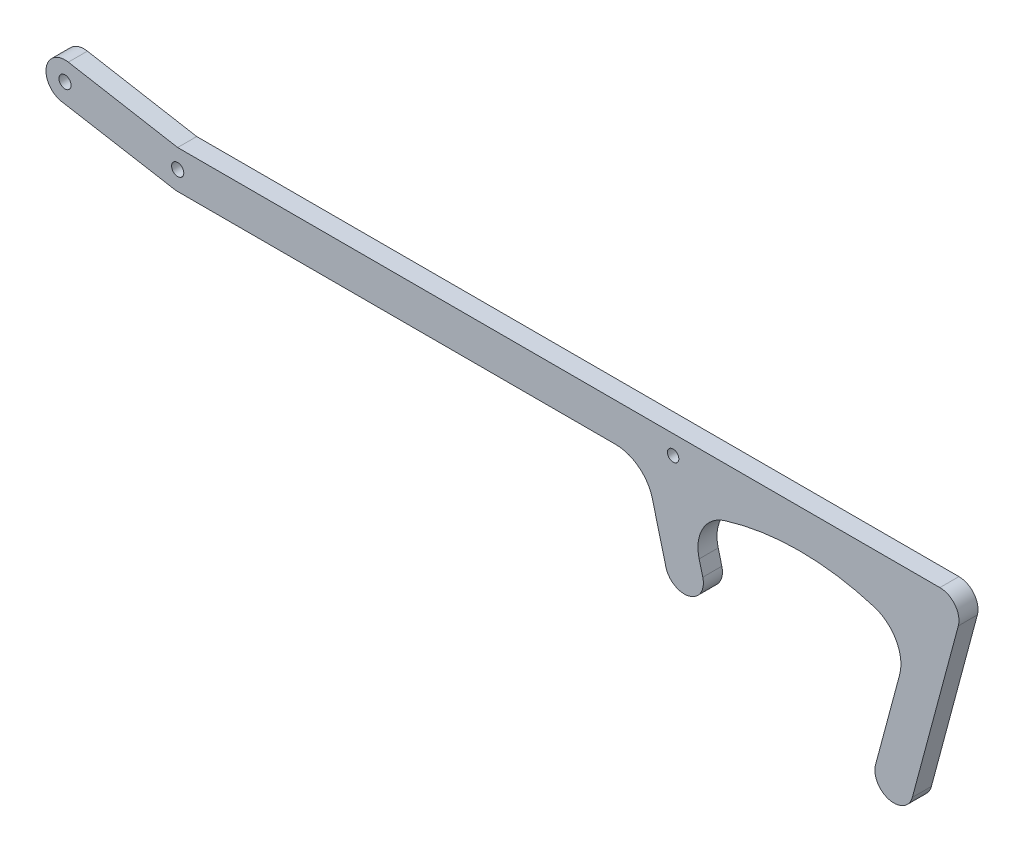
ISO-10303-21;
HEADER;
FILE_DESCRIPTION(('STEP AP214'),'2;1');
FILE_NAME('part.step','',(''),(''),'','','');
FILE_SCHEMA(('AUTOMOTIVE_DESIGN { 1 0 10303 214 1 1 1 1 }'));
ENDSEC;
DATA;
#1=APPLICATION_CONTEXT('core data for automotive mechanical design processes');
#2=APPLICATION_PROTOCOL_DEFINITION('international standard','automotive_design',2000,#1);
#3=PRODUCT_CONTEXT('',#1,'mechanical');
#4=PRODUCT('Part','Part','',(#3));
#5=PRODUCT_RELATED_PRODUCT_CATEGORY('part','',(#4));
#6=PRODUCT_DEFINITION_FORMATION('','',#4);
#7=PRODUCT_DEFINITION_CONTEXT('part definition',#1,'design');
#8=PRODUCT_DEFINITION('design','',#6,#7);
#9=PRODUCT_DEFINITION_SHAPE('','',#8);
#10=(LENGTH_UNIT() NAMED_UNIT(*) SI_UNIT(.MILLI.,.METRE.));
#11=(NAMED_UNIT(*) PLANE_ANGLE_UNIT() SI_UNIT($,.RADIAN.));
#12=(NAMED_UNIT(*) SI_UNIT($,.STERADIAN.) SOLID_ANGLE_UNIT());
#13=UNCERTAINTY_MEASURE_WITH_UNIT(LENGTH_MEASURE(1.E-05),#10,'distance_accuracy_value','');
#14=(GEOMETRIC_REPRESENTATION_CONTEXT(3) GLOBAL_UNCERTAINTY_ASSIGNED_CONTEXT((#13)) GLOBAL_UNIT_ASSIGNED_CONTEXT((#10,
#11,#12)) REPRESENTATION_CONTEXT('',''));
#15=CARTESIAN_POINT('',(0.,0.,0.));
#16=DIRECTION('',(0.,0.,1.));
#17=DIRECTION('',(1.,0.,0.));
#18=AXIS2_PLACEMENT_3D('',#15,#16,#17);
#19=CARTESIAN_POINT('',(-37.5378070842095,6.5209692001013,-3.175));
#20=DIRECTION('',(0.,0.,-1.));
#21=DIRECTION('',(1.,0.,0.));
#22=AXIS2_PLACEMENT_3D('',#19,#20,#21);
#23=PLANE('',#22);
#24=CARTESIAN_POINT('',(-37.5378070842095,6.5209692001013,-3.175));
#25=DIRECTION('',(0.,0.,1.));
#26=DIRECTION('',(1.,0.,0.));
#27=AXIS2_PLACEMENT_3D('',#24,#25,#26);
#28=CIRCLE('',#27,2.03199999999971);
#29=CARTESIAN_POINT('',(-35.5058070842098,6.5209692001013,-3.175));
#30=VERTEX_POINT('',#29);
#31=EDGE_CURVE('E588',#30,#30,#28,.T.);
#32=ORIENTED_EDGE('',*,*,#31,.T.);
#33=EDGE_LOOP('',(#32));
#34=FACE_BOUND('',#33,.T.);
#35=DIRECTION('',(-0.984807753012207,0.173648177666938,0.));
#36=VECTOR('',#35,1.);
#37=CARTESIAN_POINT('',(0.,6.35,-3.175));
#38=LINE('',#37,#36);
#39=CARTESIAN_POINT('',(0.,6.35,-3.175));
#40=VERTEX_POINT('',#39);
#41=CARTESIAN_POINT('',(-36.4351411560245,12.7744984317288,-3.175));
#42=VERTEX_POINT('',#41);
#43=EDGE_CURVE('E195',#40,#42,#38,.T.);
#44=ORIENTED_EDGE('',*,*,#43,.F.);
#45=DIRECTION('',(-1.,0.,0.));
#46=VECTOR('',#45,1.);
#47=CARTESIAN_POINT('',(0.,6.35,-3.175));
#48=LINE('',#47,#46);
#49=CARTESIAN_POINT('',(254.,6.35,-3.175));
#50=VERTEX_POINT('',#49);
#51=EDGE_CURVE('E250',#50,#40,#48,.T.);
#52=ORIENTED_EDGE('',*,*,#51,.F.);
#53=CARTESIAN_POINT('',(254.,0.,-3.175));
#54=DIRECTION('',(0.,0.,1.));
#55=DIRECTION('',(1.,0.,0.));
#56=AXIS2_PLACEMENT_3D('',#53,#54,#55);
#57=CIRCLE('',#56,6.35000000000004);
#58=CARTESIAN_POINT('',(260.133628996936,-1.64350093640105,-3.175));
#59=VERTEX_POINT('',#58);
#60=EDGE_CURVE('E247',#59,#50,#57,.T.);
#61=ORIENTED_EDGE('',*,*,#60,.F.);
#62=DIRECTION('',(0.258819045102526,0.965925826289067,0.));
#63=VECTOR('',#62,1.);
#64=CARTESIAN_POINT('',(260.133628996936,-1.64350093640105,-3.175));
#65=LINE('',#64,#63);
#66=CARTESIAN_POINT('',(244.820332649497,-58.793500936401,-3.175));
#67=VERTEX_POINT('',#66);
#68=EDGE_CURVE('E244',#67,#59,#65,.T.);
#69=ORIENTED_EDGE('',*,*,#68,.F.);
#70=CARTESIAN_POINT('',(238.686703652561,-57.15,-3.175));
#71=DIRECTION('',(0.,0.,1.));
#72=DIRECTION('',(1.,0.,0.));
#73=AXIS2_PLACEMENT_3D('',#70,#71,#72);
#74=CIRCLE('',#73,6.35000000000002);
#75=CARTESIAN_POINT('',(232.553074655625,-55.506499063599,-3.175));
#76=VERTEX_POINT('',#75);
#77=EDGE_CURVE('E241',#76,#67,#74,.T.);
#78=ORIENTED_EDGE('',*,*,#77,.F.);
#79=DIRECTION('',(-0.258819045102525,-0.965925826289067,0.));
#80=VECTOR('',#79,1.);
#81=CARTESIAN_POINT('',(232.553074655625,-55.506499063599,-3.175));
#82=LINE('',#81,#80);
#83=CARTESIAN_POINT('',(240.574948810008,-25.5684571475221,-3.175));
#84=VERTEX_POINT('',#83);
#85=EDGE_CURVE('E238',#84,#76,#82,.T.);
#86=ORIENTED_EDGE('',*,*,#85,.F.);
#87=CARTESIAN_POINT('',(228.307690816136,-22.28145527472,-3.175));
#88=DIRECTION('',(0.,0.,1.));
#89=DIRECTION('',(1.,0.,0.));
#90=AXIS2_PLACEMENT_3D('',#87,#88,#89);
#91=CIRCLE('',#90,12.7);
#92=CARTESIAN_POINT('',(232.036420714004,-10.14116807265,-3.175));
#93=VERTEX_POINT('',#92);
#94=EDGE_CURVE('E333',#93,#84,#91,.F.);
#95=ORIENTED_EDGE('',*,*,#94,.F.);
#96=CARTESIAN_POINT('',(207.240366893182,-90.8740779664155,-3.175));
#97=DIRECTION('',(0.,0.,-1.));
#98=DIRECTION('',(-1.,0.,0.));
#99=AXIS2_PLACEMENT_3D('',#96,#97,#98);
#100=CIRCLE('',#99,84.455);
#101=CARTESIAN_POINT('',(182.328357232311,-10.176873555998,-3.175));
#102=VERTEX_POINT('',#101);
#103=EDGE_CURVE('E235',#102,#93,#100,.T.);
#104=ORIENTED_EDGE('',*,*,#103,.F.);
#105=CARTESIAN_POINT('',(186.074524098608,-22.3117915124518,-3.175));
#106=DIRECTION('',(0.,0.,1.));
#107=DIRECTION('',(1.,0.,0.));
#108=AXIS2_PLACEMENT_3D('',#105,#106,#107);
#109=CIRCLE('',#108,12.7);
#110=CARTESIAN_POINT('',(173.777801974399,-25.4867915124518,-3.175));
#111=VERTEX_POINT('',#110);
#112=EDGE_CURVE('E11',#111,#102,#109,.F.);
#113=ORIENTED_EDGE('',*,*,#112,.F.);
#114=DIRECTION('',(-0.249999999999999,0.968245836551854,0.));
#115=VECTOR('',#114,1.);
#116=CARTESIAN_POINT('',(174.985064714665,-30.1625,-3.175));
#117=LINE('',#116,#115);
#118=CARTESIAN_POINT('',(174.985064714665,-30.1625,-3.175));
#119=VERTEX_POINT('',#118);
#120=EDGE_CURVE('E233',#119,#111,#117,.T.);
#121=ORIENTED_EDGE('',*,*,#120,.F.);
#122=CARTESIAN_POINT('',(168.836703652561,-31.75,-3.175));
#123=DIRECTION('',(0.,0.,1.));
#124=DIRECTION('',(1.,0.,0.));
#125=AXIS2_PLACEMENT_3D('',#122,#123,#124);
#126=CIRCLE('',#125,6.35000000000002);
#127=CARTESIAN_POINT('',(162.688342590457,-33.3375,-3.175));
#128=VERTEX_POINT('',#127);
#129=EDGE_CURVE('E230',#128,#119,#126,.T.);
#130=ORIENTED_EDGE('',*,*,#129,.F.);
#131=DIRECTION('',(0.249999999999998,-0.968245836551855,0.));
#132=VECTOR('',#131,1.);
#133=CARTESIAN_POINT('',(162.688342590457,-33.3375,-3.175));
#134=LINE('',#133,#132);
#135=CARTESIAN_POINT('',(158.179544478247,-15.875,-3.175));
#136=VERTEX_POINT('',#135);
#137=EDGE_CURVE('E227',#136,#128,#134,.T.);
#138=ORIENTED_EDGE('',*,*,#137,.F.);
#139=CARTESIAN_POINT('',(145.882822354038,-19.05,-3.175));
#140=DIRECTION('',(0.,0.,1.));
#141=DIRECTION('',(1.,0.,0.));
#142=AXIS2_PLACEMENT_3D('',#139,#140,#141);
#143=CIRCLE('',#142,12.7);
#144=CARTESIAN_POINT('',(145.882822354038,-6.35,-3.175));
#145=VERTEX_POINT('',#144);
#146=EDGE_CURVE('E320',#145,#136,#143,.F.);
#147=ORIENTED_EDGE('',*,*,#146,.F.);
#148=DIRECTION('',(1.,0.,0.));
#149=VECTOR('',#148,1.);
#150=CARTESIAN_POINT('',(0.,-6.35,-3.175));
#151=LINE('',#150,#149);
#152=CARTESIAN_POINT('',(0.,-6.35,-3.175));
#153=VERTEX_POINT('',#152);
#154=EDGE_CURVE('E223',#153,#145,#151,.T.);
#155=ORIENTED_EDGE('',*,*,#154,.F.);
#156=CARTESIAN_POINT('',(0.,0.,-3.175));
#157=DIRECTION('',(0.,0.,1.));
#158=DIRECTION('',(-1.,0.,0.));
#159=AXIS2_PLACEMENT_3D('',#156,#157,#158);
#160=CIRCLE('',#159,6.35);
#161=CARTESIAN_POINT('',(-1.08682820001688,-6.25630118070159,-3.175));
#162=VERTEX_POINT('',#161);
#163=EDGE_CURVE('E219',#162,#153,#160,.T.);
#164=ORIENTED_EDGE('',*,*,#163,.F.);
#165=DIRECTION('',(0.985244280425447,-0.171154047246753,0.));
#166=VECTOR('',#165,1.);
#167=CARTESIAN_POINT('',(-38.6246352842264,0.264668019399712,-3.175));
#168=LINE('',#167,#166);
#169=CARTESIAN_POINT('',(-38.6246352842264,0.264668019399712,-3.175));
#170=VERTEX_POINT('',#169);
#171=EDGE_CURVE('E198',#170,#162,#168,.T.);
#172=ORIENTED_EDGE('',*,*,#171,.F.);
#173=CARTESIAN_POINT('',(-37.5378070842095,6.5209692001013,-3.175));
#174=DIRECTION('',(0.,0.,1.));
#175=DIRECTION('',(1.,0.,0.));
#176=AXIS2_PLACEMENT_3D('',#173,#174,#175);
#177=CIRCLE('',#176,6.35);
#178=EDGE_CURVE('E179',#42,#170,#177,.T.);
#179=ORIENTED_EDGE('',*,*,#178,.F.);
#180=EDGE_LOOP('',(#44,#52,#61,#69,#78,#86,#95,#104,#113,#121,#130,#138,#147,#155,#164,#172,#179));
#181=FACE_BOUND('',#180,.T.);
#182=CARTESIAN_POINT('',(0.,0.,-3.175));
#183=DIRECTION('',(0.,0.,1.));
#184=DIRECTION('',(1.,0.,0.));
#185=AXIS2_PLACEMENT_3D('',#182,#183,#184);
#186=CIRCLE('',#185,2.032);
#187=CARTESIAN_POINT('',(2.032,0.,-3.175));
#188=VERTEX_POINT('',#187);
#189=EDGE_CURVE('E255',#188,#188,#186,.T.);
#190=ORIENTED_EDGE('',*,*,#189,.T.);
#191=EDGE_LOOP('',(#190));
#192=FACE_BOUND('',#191,.T.);
#193=CARTESIAN_POINT('',(165.1,0.,-3.175));
#194=DIRECTION('',(0.,0.,1.));
#195=DIRECTION('',(1.,0.,0.));
#196=AXIS2_PLACEMENT_3D('',#193,#194,#195);
#197=CIRCLE('',#196,1.90499999999999);
#198=CARTESIAN_POINT('',(167.005,0.,-3.175));
#199=VERTEX_POINT('',#198);
#200=EDGE_CURVE('E579',#199,#199,#197,.T.);
#201=ORIENTED_EDGE('',*,*,#200,.T.);
#202=EDGE_LOOP('',(#201));
#203=FACE_BOUND('',#202,.T.);
#204=ADVANCED_FACE('F49',(#34,#181,#192,#203),#23,.T.);
#205=CARTESIAN_POINT('',(-37.5378070842095,6.5209692001013,3.175));
#206=DIRECTION('',(0.,0.,-1.));
#207=DIRECTION('',(1.,0.,0.));
#208=AXIS2_PLACEMENT_3D('',#205,#206,#207);
#209=PLANE('',#208);
#210=DIRECTION('',(-0.984807753012207,0.173648177666938,0.));
#211=VECTOR('',#210,1.);
#212=CARTESIAN_POINT('',(0.,6.35,3.175));
#213=LINE('',#212,#211);
#214=CARTESIAN_POINT('',(0.,6.35,3.175));
#215=VERTEX_POINT('',#214);
#216=CARTESIAN_POINT('',(-36.4351411560245,12.7744984317288,3.175));
#217=VERTEX_POINT('',#216);
#218=EDGE_CURVE('E253',#215,#217,#213,.T.);
#219=ORIENTED_EDGE('',*,*,#218,.T.);
#220=CARTESIAN_POINT('',(-37.5378070842095,6.5209692001013,3.175));
#221=DIRECTION('',(0.,0.,1.));
#222=DIRECTION('',(1.,0.,0.));
#223=AXIS2_PLACEMENT_3D('',#220,#221,#222);
#224=CIRCLE('',#223,6.35);
#225=CARTESIAN_POINT('',(-38.6246352842264,0.264668019399712,3.175));
#226=VERTEX_POINT('',#225);
#227=EDGE_CURVE('E182',#217,#226,#224,.T.);
#228=ORIENTED_EDGE('',*,*,#227,.T.);
#229=DIRECTION('',(0.985244280425447,-0.171154047246753,0.));
#230=VECTOR('',#229,1.);
#231=CARTESIAN_POINT('',(-38.6246352842264,0.264668019399712,3.175));
#232=LINE('',#231,#230);
#233=CARTESIAN_POINT('',(-1.08682820001688,-6.25630118070159,3.175));
#234=VERTEX_POINT('',#233);
#235=EDGE_CURVE('E258',#226,#234,#232,.T.);
#236=ORIENTED_EDGE('',*,*,#235,.T.);
#237=CARTESIAN_POINT('',(0.,0.,3.175));
#238=DIRECTION('',(0.,0.,1.));
#239=DIRECTION('',(-1.,0.,0.));
#240=AXIS2_PLACEMENT_3D('',#237,#238,#239);
#241=CIRCLE('',#240,6.35);
#242=CARTESIAN_POINT('',(0.,-6.35,3.175));
#243=VERTEX_POINT('',#242);
#244=EDGE_CURVE('E262',#234,#243,#241,.T.);
#245=ORIENTED_EDGE('',*,*,#244,.T.);
#246=DIRECTION('',(1.,0.,0.));
#247=VECTOR('',#246,1.);
#248=CARTESIAN_POINT('',(0.,-6.35,3.175));
#249=LINE('',#248,#247);
#250=CARTESIAN_POINT('',(145.882822354038,-6.35,3.175));
#251=VERTEX_POINT('',#250);
#252=EDGE_CURVE('E266',#243,#251,#249,.T.);
#253=ORIENTED_EDGE('',*,*,#252,.T.);
#254=CARTESIAN_POINT('',(145.882822354038,-19.05,3.175));
#255=DIRECTION('',(0.,0.,1.));
#256=DIRECTION('',(1.,0.,0.));
#257=AXIS2_PLACEMENT_3D('',#254,#255,#256);
#258=CIRCLE('',#257,12.7);
#259=CARTESIAN_POINT('',(158.179544478247,-15.875,3.175));
#260=VERTEX_POINT('',#259);
#261=EDGE_CURVE('E317',#260,#251,#258,.T.);
#262=ORIENTED_EDGE('',*,*,#261,.F.);
#263=DIRECTION('',(0.249999999999998,-0.968245836551855,0.));
#264=VECTOR('',#263,1.);
#265=CARTESIAN_POINT('',(162.688342590457,-33.3375,3.175));
#266=LINE('',#265,#264);
#267=CARTESIAN_POINT('',(162.688342590457,-33.3375,3.175));
#268=VERTEX_POINT('',#267);
#269=EDGE_CURVE('E270',#260,#268,#266,.T.);
#270=ORIENTED_EDGE('',*,*,#269,.T.);
#271=CARTESIAN_POINT('',(168.836703652561,-31.75,3.175));
#272=DIRECTION('',(0.,0.,1.));
#273=DIRECTION('',(1.,0.,0.));
#274=AXIS2_PLACEMENT_3D('',#271,#272,#273);
#275=CIRCLE('',#274,6.35000000000002);
#276=CARTESIAN_POINT('',(174.985064714665,-30.1625,3.175));
#277=VERTEX_POINT('',#276);
#278=EDGE_CURVE('E273',#268,#277,#275,.T.);
#279=ORIENTED_EDGE('',*,*,#278,.T.);
#280=DIRECTION('',(-0.249999999999999,0.968245836551854,0.));
#281=VECTOR('',#280,1.);
#282=CARTESIAN_POINT('',(174.985064714665,-30.1625,3.175));
#283=LINE('',#282,#281);
#284=CARTESIAN_POINT('',(173.777801974399,-25.4867915124518,3.175));
#285=VERTEX_POINT('',#284);
#286=EDGE_CURVE('E276',#277,#285,#283,.T.);
#287=ORIENTED_EDGE('',*,*,#286,.T.);
#288=CARTESIAN_POINT('',(186.074524098608,-22.3117915124518,3.175));
#289=DIRECTION('',(0.,0.,1.));
#290=DIRECTION('',(1.,0.,0.));
#291=AXIS2_PLACEMENT_3D('',#288,#289,#290);
#292=CIRCLE('',#291,12.7);
#293=CARTESIAN_POINT('',(182.328357232311,-10.176873555998,3.175));
#294=VERTEX_POINT('',#293);
#295=EDGE_CURVE('E57',#294,#285,#292,.T.);
#296=ORIENTED_EDGE('',*,*,#295,.F.);
#297=CARTESIAN_POINT('',(207.240366893182,-90.8740779664155,3.175));
#298=DIRECTION('',(0.,0.,-1.));
#299=DIRECTION('',(-1.,0.,0.));
#300=AXIS2_PLACEMENT_3D('',#297,#298,#299);
#301=CIRCLE('',#300,84.455);
#302=CARTESIAN_POINT('',(232.036420714004,-10.14116807265,3.175));
#303=VERTEX_POINT('',#302);
#304=EDGE_CURVE('E279',#294,#303,#301,.T.);
#305=ORIENTED_EDGE('',*,*,#304,.T.);
#306=CARTESIAN_POINT('',(228.307690816136,-22.28145527472,3.175));
#307=DIRECTION('',(0.,0.,1.));
#308=DIRECTION('',(1.,0.,0.));
#309=AXIS2_PLACEMENT_3D('',#306,#307,#308);
#310=CIRCLE('',#309,12.7);
#311=CARTESIAN_POINT('',(240.574948810008,-25.5684571475221,3.175));
#312=VERTEX_POINT('',#311);
#313=EDGE_CURVE('E330',#312,#303,#310,.T.);
#314=ORIENTED_EDGE('',*,*,#313,.F.);
#315=DIRECTION('',(-0.258819045102525,-0.965925826289067,0.));
#316=VECTOR('',#315,1.);
#317=CARTESIAN_POINT('',(232.553074655625,-55.506499063599,3.175));
#318=LINE('',#317,#316);
#319=CARTESIAN_POINT('',(232.553074655625,-55.506499063599,3.175));
#320=VERTEX_POINT('',#319);
#321=EDGE_CURVE('E282',#312,#320,#318,.T.);
#322=ORIENTED_EDGE('',*,*,#321,.T.);
#323=CARTESIAN_POINT('',(238.686703652561,-57.15,3.175));
#324=DIRECTION('',(0.,0.,1.));
#325=DIRECTION('',(1.,0.,0.));
#326=AXIS2_PLACEMENT_3D('',#323,#324,#325);
#327=CIRCLE('',#326,6.35000000000002);
#328=CARTESIAN_POINT('',(244.820332649497,-58.793500936401,3.175));
#329=VERTEX_POINT('',#328);
#330=EDGE_CURVE('E285',#320,#329,#327,.T.);
#331=ORIENTED_EDGE('',*,*,#330,.T.);
#332=DIRECTION('',(0.258819045102526,0.965925826289067,0.));
#333=VECTOR('',#332,1.);
#334=CARTESIAN_POINT('',(260.133628996936,-1.64350093640105,3.175));
#335=LINE('',#334,#333);
#336=CARTESIAN_POINT('',(260.133628996936,-1.64350093640105,3.175));
#337=VERTEX_POINT('',#336);
#338=EDGE_CURVE('E288',#329,#337,#335,.T.);
#339=ORIENTED_EDGE('',*,*,#338,.T.);
#340=CARTESIAN_POINT('',(254.,0.,3.175));
#341=DIRECTION('',(0.,0.,1.));
#342=DIRECTION('',(1.,0.,0.));
#343=AXIS2_PLACEMENT_3D('',#340,#341,#342);
#344=CIRCLE('',#343,6.35000000000004);
#345=CARTESIAN_POINT('',(254.,6.35,3.175));
#346=VERTEX_POINT('',#345);
#347=EDGE_CURVE('E211',#337,#346,#344,.T.);
#348=ORIENTED_EDGE('',*,*,#347,.T.);
#349=DIRECTION('',(-1.,0.,0.));
#350=VECTOR('',#349,1.);
#351=CARTESIAN_POINT('',(0.,6.35,3.175));
#352=LINE('',#351,#350);
#353=EDGE_CURVE('E205',#346,#215,#352,.T.);
#354=ORIENTED_EDGE('',*,*,#353,.T.);
#355=EDGE_LOOP('',(#219,#228,#236,#245,#253,#262,#270,#279,#287,#296,#305,#314,#322,#331,#339,
#348,#354));
#356=FACE_BOUND('',#355,.T.);
#357=CARTESIAN_POINT('',(0.,0.,3.175));
#358=DIRECTION('',(0.,0.,1.));
#359=DIRECTION('',(1.,0.,0.));
#360=AXIS2_PLACEMENT_3D('',#357,#358,#359);
#361=CIRCLE('',#360,2.032);
#362=CARTESIAN_POINT('',(2.032,0.,3.175));
#363=VERTEX_POINT('',#362);
#364=EDGE_CURVE('E214',#363,#363,#361,.T.);
#365=ORIENTED_EDGE('',*,*,#364,.F.);
#366=EDGE_LOOP('',(#365));
#367=FACE_BOUND('',#366,.T.);
#368=CARTESIAN_POINT('',(-37.5378070842095,6.5209692001013,3.175));
#369=DIRECTION('',(0.,0.,1.));
#370=DIRECTION('',(1.,0.,0.));
#371=AXIS2_PLACEMENT_3D('',#368,#369,#370);
#372=CIRCLE('',#371,2.03199999999971);
#373=CARTESIAN_POINT('',(-35.5058070842098,6.5209692001013,3.175));
#374=VERTEX_POINT('',#373);
#375=EDGE_CURVE('E585',#374,#374,#372,.T.);
#376=ORIENTED_EDGE('',*,*,#375,.F.);
#377=EDGE_LOOP('',(#376));
#378=FACE_BOUND('',#377,.T.);
#379=CARTESIAN_POINT('',(165.1,0.,3.175));
#380=DIRECTION('',(0.,0.,1.));
#381=DIRECTION('',(1.,0.,0.));
#382=AXIS2_PLACEMENT_3D('',#379,#380,#381);
#383=CIRCLE('',#382,1.90499999999999);
#384=CARTESIAN_POINT('',(167.005,0.,3.175));
#385=VERTEX_POINT('',#384);
#386=EDGE_CURVE('E582',#385,#385,#383,.T.);
#387=ORIENTED_EDGE('',*,*,#386,.F.);
#388=EDGE_LOOP('',(#387));
#389=FACE_BOUND('',#388,.T.);
#390=ADVANCED_FACE('F338',(#356,#367,#378,#389),#209,.F.);
#391=CARTESIAN_POINT('',(0.,6.35,-3.175));
#392=DIRECTION('',(-0.173648177666938,-0.984807753012207,0.));
#393=DIRECTION('',(0.984807753012207,-0.173648177666938,0.));
#394=AXIS2_PLACEMENT_3D('',#391,#392,#393);
#395=PLANE('',#394);
#396=ORIENTED_EDGE('',*,*,#218,.F.);
#397=DIRECTION('',(0.,0.,1.));
#398=VECTOR('',#397,1.);
#399=CARTESIAN_POINT('',(0.,6.35,-3.175));
#400=LINE('',#399,#398);
#401=EDGE_CURVE('E202',#40,#215,#400,.T.);
#402=ORIENTED_EDGE('',*,*,#401,.F.);
#403=ORIENTED_EDGE('',*,*,#43,.T.);
#404=DIRECTION('',(0.,0.,1.));
#405=VECTOR('',#404,1.);
#406=CARTESIAN_POINT('',(-36.4351411560245,12.7744984317288,-3.175));
#407=LINE('',#406,#405);
#408=EDGE_CURVE('E176',#42,#217,#407,.T.);
#409=ORIENTED_EDGE('',*,*,#408,.T.);
#410=EDGE_LOOP('',(#396,#402,#403,#409));
#411=FACE_BOUND('',#410,.T.);
#412=ADVANCED_FACE('F201',(#411),#395,.F.);
#413=CARTESIAN_POINT('',(-37.5378070842095,6.5209692001013,-3.175));
#414=DIRECTION('',(0.,0.,1.));
#415=DIRECTION('',(-1.,0.,0.));
#416=AXIS2_PLACEMENT_3D('',#413,#414,#415);
#417=CYLINDRICAL_SURFACE('',#416,6.35);
#418=ORIENTED_EDGE('',*,*,#227,.F.);
#419=ORIENTED_EDGE('',*,*,#408,.F.);
#420=ORIENTED_EDGE('',*,*,#178,.T.);
#421=DIRECTION('',(0.,0.,1.));
#422=VECTOR('',#421,1.);
#423=CARTESIAN_POINT('',(-38.6246352842264,0.264668019399712,-3.175));
#424=LINE('',#423,#422);
#425=EDGE_CURVE('E189',#170,#226,#424,.T.);
#426=ORIENTED_EDGE('',*,*,#425,.T.);
#427=EDGE_LOOP('',(#418,#419,#420,#426));
#428=FACE_BOUND('',#427,.T.);
#429=ADVANCED_FACE('F178',(#428),#417,.T.);
#430=CARTESIAN_POINT('',(-38.6246352842264,0.264668019399712,-3.175));
#431=DIRECTION('',(0.171154047246753,0.985244280425447,0.));
#432=DIRECTION('',(-0.985244280425447,0.171154047246753,0.));
#433=AXIS2_PLACEMENT_3D('',#430,#431,#432);
#434=PLANE('',#433);
#435=ORIENTED_EDGE('',*,*,#235,.F.);
#436=ORIENTED_EDGE('',*,*,#425,.F.);
#437=ORIENTED_EDGE('',*,*,#171,.T.);
#438=DIRECTION('',(0.,0.,1.));
#439=VECTOR('',#438,1.);
#440=CARTESIAN_POINT('',(-1.08682820001688,-6.25630118070159,-3.175));
#441=LINE('',#440,#439);
#442=EDGE_CURVE('E309',#162,#234,#441,.T.);
#443=ORIENTED_EDGE('',*,*,#442,.T.);
#444=EDGE_LOOP('',(#435,#436,#437,#443));
#445=FACE_BOUND('',#444,.T.);
#446=ADVANCED_FACE('F377',(#445),#434,.F.);
#447=CARTESIAN_POINT('',(0.,0.,-3.175));
#448=DIRECTION('',(0.,0.,1.));
#449=DIRECTION('',(-1.,0.,0.));
#450=AXIS2_PLACEMENT_3D('',#447,#448,#449);
#451=CYLINDRICAL_SURFACE('',#450,6.35);
#452=ORIENTED_EDGE('',*,*,#244,.F.);
#453=ORIENTED_EDGE('',*,*,#442,.F.);
#454=ORIENTED_EDGE('',*,*,#163,.T.);
#455=DIRECTION('',(0.,0.,1.));
#456=VECTOR('',#455,1.);
#457=CARTESIAN_POINT('',(0.,-6.35,-3.175));
#458=LINE('',#457,#456);
#459=EDGE_CURVE('E306',#153,#243,#458,.T.);
#460=ORIENTED_EDGE('',*,*,#459,.T.);
#461=EDGE_LOOP('',(#452,#453,#454,#460));
#462=FACE_BOUND('',#461,.T.);
#463=ADVANCED_FACE('F379',(#462),#451,.T.);
#464=CARTESIAN_POINT('',(0.,-6.35,-3.175));
#465=DIRECTION('',(0.,1.,0.));
#466=DIRECTION('',(-1.,0.,0.));
#467=AXIS2_PLACEMENT_3D('',#464,#465,#466);
#468=PLANE('',#467);
#469=ORIENTED_EDGE('',*,*,#252,.F.);
#470=ORIENTED_EDGE('',*,*,#459,.F.);
#471=ORIENTED_EDGE('',*,*,#154,.T.);
#472=DIRECTION('',(0.,0.,1.));
#473=VECTOR('',#472,1.);
#474=CARTESIAN_POINT('',(145.882822354038,-6.35,-3.175));
#475=LINE('',#474,#473);
#476=EDGE_CURVE('E315',#251,#145,#475,.F.);
#477=ORIENTED_EDGE('',*,*,#476,.F.);
#478=EDGE_LOOP('',(#469,#470,#471,#477));
#479=FACE_BOUND('',#478,.T.);
#480=ADVANCED_FACE('F383',(#479),#468,.F.);
#481=CARTESIAN_POINT('',(162.688342590457,-33.3375,-3.175));
#482=DIRECTION('',(0.968245836551855,0.249999999999998,0.));
#483=DIRECTION('',(-0.249999999999998,0.968245836551855,0.));
#484=AXIS2_PLACEMENT_3D('',#481,#482,#483);
#485=PLANE('',#484);
#486=ORIENTED_EDGE('',*,*,#137,.T.);
#487=DIRECTION('',(0.,0.,1.));
#488=VECTOR('',#487,1.);
#489=CARTESIAN_POINT('',(162.688342590457,-33.3375,-3.175));
#490=LINE('',#489,#488);
#491=EDGE_CURVE('E304',#128,#268,#490,.T.);
#492=ORIENTED_EDGE('',*,*,#491,.T.);
#493=ORIENTED_EDGE('',*,*,#269,.F.);
#494=DIRECTION('',(0.,0.,1.));
#495=VECTOR('',#494,1.);
#496=CARTESIAN_POINT('',(158.179544478247,-15.875,3.175));
#497=LINE('',#496,#495);
#498=EDGE_CURVE('E188',#136,#260,#497,.T.);
#499=ORIENTED_EDGE('',*,*,#498,.F.);
#500=EDGE_LOOP('',(#486,#492,#493,#499));
#501=FACE_BOUND('',#500,.T.);
#502=ADVANCED_FACE('F390',(#501),#485,.F.);
#503=CARTESIAN_POINT('',(168.836703652561,-31.75,-3.175));
#504=DIRECTION('',(0.,0.,1.));
#505=DIRECTION('',(-1.,0.,0.));
#506=AXIS2_PLACEMENT_3D('',#503,#504,#505);
#507=CYLINDRICAL_SURFACE('',#506,6.35000000000002);
#508=ORIENTED_EDGE('',*,*,#278,.F.);
#509=ORIENTED_EDGE('',*,*,#491,.F.);
#510=ORIENTED_EDGE('',*,*,#129,.T.);
#511=DIRECTION('',(0.,0.,1.));
#512=VECTOR('',#511,1.);
#513=CARTESIAN_POINT('',(174.985064714665,-30.1625,-3.175));
#514=LINE('',#513,#512);
#515=EDGE_CURVE('E302',#119,#277,#514,.T.);
#516=ORIENTED_EDGE('',*,*,#515,.T.);
#517=EDGE_LOOP('',(#508,#509,#510,#516));
#518=FACE_BOUND('',#517,.T.);
#519=ADVANCED_FACE('F346',(#518),#507,.T.);
#520=CARTESIAN_POINT('',(174.985064714665,-30.1625,-3.175));
#521=DIRECTION('',(-0.968245836551854,-0.249999999999999,0.));
#522=DIRECTION('',(0.25,-0.968245836551854,0.));
#523=AXIS2_PLACEMENT_3D('',#520,#521,#522);
#524=PLANE('',#523);
#525=ORIENTED_EDGE('',*,*,#286,.F.);
#526=ORIENTED_EDGE('',*,*,#515,.F.);
#527=ORIENTED_EDGE('',*,*,#120,.T.);
#528=DIRECTION('',(0.,0.,-1.));
#529=VECTOR('',#528,1.);
#530=CARTESIAN_POINT('',(173.777801974399,-25.4867915124518,-3.175));
#531=LINE('',#530,#529);
#532=EDGE_CURVE('E63',#285,#111,#531,.T.);
#533=ORIENTED_EDGE('',*,*,#532,.F.);
#534=EDGE_LOOP('',(#525,#526,#527,#533));
#535=FACE_BOUND('',#534,.T.);
#536=ADVANCED_FACE('F341',(#535),#524,.F.);
#537=CARTESIAN_POINT('',(207.240366893182,-90.8740779664155,-3.175));
#538=DIRECTION('',(0.,0.,1.));
#539=DIRECTION('',(-1.,0.,0.));
#540=AXIS2_PLACEMENT_3D('',#537,#538,#539);
#541=CYLINDRICAL_SURFACE('',#540,84.455);
#542=ORIENTED_EDGE('',*,*,#304,.F.);
#543=DIRECTION('',(0.,0.,1.));
#544=VECTOR('',#543,1.);
#545=CARTESIAN_POINT('',(182.328357232311,-10.176873555998,-3.175));
#546=LINE('',#545,#544);
#547=EDGE_CURVE('E325',#102,#294,#546,.T.);
#548=ORIENTED_EDGE('',*,*,#547,.F.);
#549=ORIENTED_EDGE('',*,*,#103,.T.);
#550=DIRECTION('',(0.,0.,1.));
#551=VECTOR('',#550,1.);
#552=CARTESIAN_POINT('',(232.036420714004,-10.14116807265,-3.175));
#553=LINE('',#552,#551);
#554=EDGE_CURVE('E327',#303,#93,#553,.F.);
#555=ORIENTED_EDGE('',*,*,#554,.F.);
#556=EDGE_LOOP('',(#542,#548,#549,#555));
#557=FACE_BOUND('',#556,.T.);
#558=ADVANCED_FACE('F352',(#557),#541,.F.);
#559=CARTESIAN_POINT('',(232.553074655625,-55.506499063599,-3.175));
#560=DIRECTION('',(0.965925826289067,-0.258819045102525,0.));
#561=DIRECTION('',(0.258819045102525,0.965925826289067,0.));
#562=AXIS2_PLACEMENT_3D('',#559,#560,#561);
#563=PLANE('',#562);
#564=ORIENTED_EDGE('',*,*,#85,.T.);
#565=DIRECTION('',(0.,0.,1.));
#566=VECTOR('',#565,1.);
#567=CARTESIAN_POINT('',(232.553074655625,-55.506499063599,-3.175));
#568=LINE('',#567,#566);
#569=EDGE_CURVE('E300',#76,#320,#568,.T.);
#570=ORIENTED_EDGE('',*,*,#569,.T.);
#571=ORIENTED_EDGE('',*,*,#321,.F.);
#572=DIRECTION('',(0.,0.,-1.));
#573=VECTOR('',#572,1.);
#574=CARTESIAN_POINT('',(240.574948810008,-25.5684571475221,3.175));
#575=LINE('',#574,#573);
#576=EDGE_CURVE('E323',#84,#312,#575,.F.);
#577=ORIENTED_EDGE('',*,*,#576,.F.);
#578=EDGE_LOOP('',(#564,#570,#571,#577));
#579=FACE_BOUND('',#578,.T.);
#580=ADVANCED_FACE('F358',(#579),#563,.F.);
#581=CARTESIAN_POINT('',(238.686703652561,-57.15,-3.175));
#582=DIRECTION('',(0.,0.,1.));
#583=DIRECTION('',(-1.,0.,0.));
#584=AXIS2_PLACEMENT_3D('',#581,#582,#583);
#585=CYLINDRICAL_SURFACE('',#584,6.35000000000002);
#586=ORIENTED_EDGE('',*,*,#330,.F.);
#587=ORIENTED_EDGE('',*,*,#569,.F.);
#588=ORIENTED_EDGE('',*,*,#77,.T.);
#589=DIRECTION('',(0.,0.,1.));
#590=VECTOR('',#589,1.);
#591=CARTESIAN_POINT('',(244.820332649497,-58.793500936401,-3.175));
#592=LINE('',#591,#590);
#593=EDGE_CURVE('E298',#67,#329,#592,.T.);
#594=ORIENTED_EDGE('',*,*,#593,.T.);
#595=EDGE_LOOP('',(#586,#587,#588,#594));
#596=FACE_BOUND('',#595,.T.);
#597=ADVANCED_FACE('F362',(#596),#585,.T.);
#598=CARTESIAN_POINT('',(260.133628996936,-1.64350093640105,-3.175));
#599=DIRECTION('',(-0.965925826289067,0.258819045102526,0.));
#600=DIRECTION('',(-0.258819045102526,-0.965925826289067,0.));
#601=AXIS2_PLACEMENT_3D('',#598,#599,#600);
#602=PLANE('',#601);
#603=ORIENTED_EDGE('',*,*,#338,.F.);
#604=ORIENTED_EDGE('',*,*,#593,.F.);
#605=ORIENTED_EDGE('',*,*,#68,.T.);
#606=DIRECTION('',(0.,0.,1.));
#607=VECTOR('',#606,1.);
#608=CARTESIAN_POINT('',(260.133628996936,-1.64350093640105,-3.175));
#609=LINE('',#608,#607);
#610=EDGE_CURVE('E296',#59,#337,#609,.T.);
#611=ORIENTED_EDGE('',*,*,#610,.T.);
#612=EDGE_LOOP('',(#603,#604,#605,#611));
#613=FACE_BOUND('',#612,.T.);
#614=ADVANCED_FACE('F366',(#613),#602,.F.);
#615=CARTESIAN_POINT('',(254.,0.,-3.175));
#616=DIRECTION('',(0.,0.,1.));
#617=DIRECTION('',(-1.,0.,0.));
#618=AXIS2_PLACEMENT_3D('',#615,#616,#617);
#619=CYLINDRICAL_SURFACE('',#618,6.35000000000004);
#620=ORIENTED_EDGE('',*,*,#347,.F.);
#621=ORIENTED_EDGE('',*,*,#610,.F.);
#622=ORIENTED_EDGE('',*,*,#60,.T.);
#623=DIRECTION('',(0.,0.,1.));
#624=VECTOR('',#623,1.);
#625=CARTESIAN_POINT('',(254.,6.35,-3.175));
#626=LINE('',#625,#624);
#627=EDGE_CURVE('E294',#50,#346,#626,.T.);
#628=ORIENTED_EDGE('',*,*,#627,.T.);
#629=EDGE_LOOP('',(#620,#621,#622,#628));
#630=FACE_BOUND('',#629,.T.);
#631=ADVANCED_FACE('F370',(#630),#619,.T.);
#632=CARTESIAN_POINT('',(0.,6.35,-3.175));
#633=DIRECTION('',(0.,-1.,0.));
#634=DIRECTION('',(0.,0.,1.));
#635=AXIS2_PLACEMENT_3D('',#632,#633,#634);
#636=PLANE('',#635);
#637=ORIENTED_EDGE('',*,*,#353,.F.);
#638=ORIENTED_EDGE('',*,*,#627,.F.);
#639=ORIENTED_EDGE('',*,*,#51,.T.);
#640=ORIENTED_EDGE('',*,*,#401,.T.);
#641=EDGE_LOOP('',(#637,#638,#639,#640));
#642=FACE_BOUND('',#641,.T.);
#643=ADVANCED_FACE('F373',(#642),#636,.F.);
#644=CARTESIAN_POINT('',(0.,0.,-3.175));
#645=DIRECTION('',(0.,0.,1.));
#646=DIRECTION('',(-1.,0.,0.));
#647=AXIS2_PLACEMENT_3D('',#644,#645,#646);
#648=CYLINDRICAL_SURFACE('',#647,2.032);
#649=ORIENTED_EDGE('',*,*,#189,.F.);
#650=EDGE_LOOP('',(#649));
#651=FACE_BOUND('',#650,.T.);
#652=ORIENTED_EDGE('',*,*,#364,.T.);
#653=EDGE_LOOP('',(#652));
#654=FACE_BOUND('',#653,.T.);
#655=ADVANCED_FACE('F407',(#651,#654),#648,.F.);
#656=CARTESIAN_POINT('',(-37.5378070842095,6.5209692001013,-3.175));
#657=DIRECTION('',(0.,0.,1.));
#658=DIRECTION('',(-1.,0.,0.));
#659=AXIS2_PLACEMENT_3D('',#656,#657,#658);
#660=CYLINDRICAL_SURFACE('',#659,2.03199999999971);
#661=ORIENTED_EDGE('',*,*,#31,.F.);
#662=EDGE_LOOP('',(#661));
#663=FACE_BOUND('',#662,.T.);
#664=ORIENTED_EDGE('',*,*,#375,.T.);
#665=EDGE_LOOP('',(#664));
#666=FACE_BOUND('',#665,.T.);
#667=ADVANCED_FACE('F464',(#663,#666),#660,.F.);
#668=CARTESIAN_POINT('',(165.1,0.,-3.175));
#669=DIRECTION('',(0.,0.,1.));
#670=DIRECTION('',(-1.,0.,0.));
#671=AXIS2_PLACEMENT_3D('',#668,#669,#670);
#672=CYLINDRICAL_SURFACE('',#671,1.90499999999999);
#673=ORIENTED_EDGE('',*,*,#200,.F.);
#674=EDGE_LOOP('',(#673));
#675=FACE_BOUND('',#674,.T.);
#676=ORIENTED_EDGE('',*,*,#386,.T.);
#677=EDGE_LOOP('',(#676));
#678=FACE_BOUND('',#677,.T.);
#679=ADVANCED_FACE('F473',(#675,#678),#672,.F.);
#680=CARTESIAN_POINT('',(145.882822354038,-19.05,-3.175));
#681=DIRECTION('',(0.,0.,-1.));
#682=DIRECTION('',(1.,0.,0.));
#683=AXIS2_PLACEMENT_3D('',#680,#681,#682);
#684=CYLINDRICAL_SURFACE('',#683,12.7);
#685=ORIENTED_EDGE('',*,*,#146,.T.);
#686=ORIENTED_EDGE('',*,*,#498,.T.);
#687=ORIENTED_EDGE('',*,*,#261,.T.);
#688=ORIENTED_EDGE('',*,*,#476,.T.);
#689=EDGE_LOOP('',(#685,#686,#687,#688));
#690=FACE_BOUND('',#689,.T.);
#691=ADVANCED_FACE('F387',(#690),#684,.F.);
#692=CARTESIAN_POINT('',(228.307690816136,-22.28145527472,-3.175));
#693=DIRECTION('',(0.,0.,1.));
#694=DIRECTION('',(-1.,0.,0.));
#695=AXIS2_PLACEMENT_3D('',#692,#693,#694);
#696=CYLINDRICAL_SURFACE('',#695,12.7);
#697=ORIENTED_EDGE('',*,*,#94,.T.);
#698=ORIENTED_EDGE('',*,*,#576,.T.);
#699=ORIENTED_EDGE('',*,*,#313,.T.);
#700=ORIENTED_EDGE('',*,*,#554,.T.);
#701=EDGE_LOOP('',(#697,#698,#699,#700));
#702=FACE_BOUND('',#701,.T.);
#703=ADVANCED_FACE('F356',(#702),#696,.F.);
#704=CARTESIAN_POINT('',(186.074524098608,-22.3117915124518,-3.175));
#705=DIRECTION('',(0.,0.,1.));
#706=DIRECTION('',(-1.,0.,0.));
#707=AXIS2_PLACEMENT_3D('',#704,#705,#706);
#708=CYLINDRICAL_SURFACE('',#707,12.7);
#709=ORIENTED_EDGE('',*,*,#112,.T.);
#710=ORIENTED_EDGE('',*,*,#547,.T.);
#711=ORIENTED_EDGE('',*,*,#295,.T.);
#712=ORIENTED_EDGE('',*,*,#532,.T.);
#713=EDGE_LOOP('',(#709,#710,#711,#712));
#714=FACE_BOUND('',#713,.T.);
#715=ADVANCED_FACE('F51',(#714),#708,.F.);
#716=CLOSED_SHELL('',(#204,#390,#412,#429,#446,#463,#480,#502,#519,#536,#558,#580,#597,#614,
#631,#643,#655,#667,#679,#691,#703,#715));
#717=MANIFOLD_SOLID_BREP('B2',#716);
#718=ADVANCED_BREP_SHAPE_REPRESENTATION('',(#18,#717),#14);
#719=SHAPE_DEFINITION_REPRESENTATION(#9,#718);
ENDSEC;
END-ISO-10303-21;
